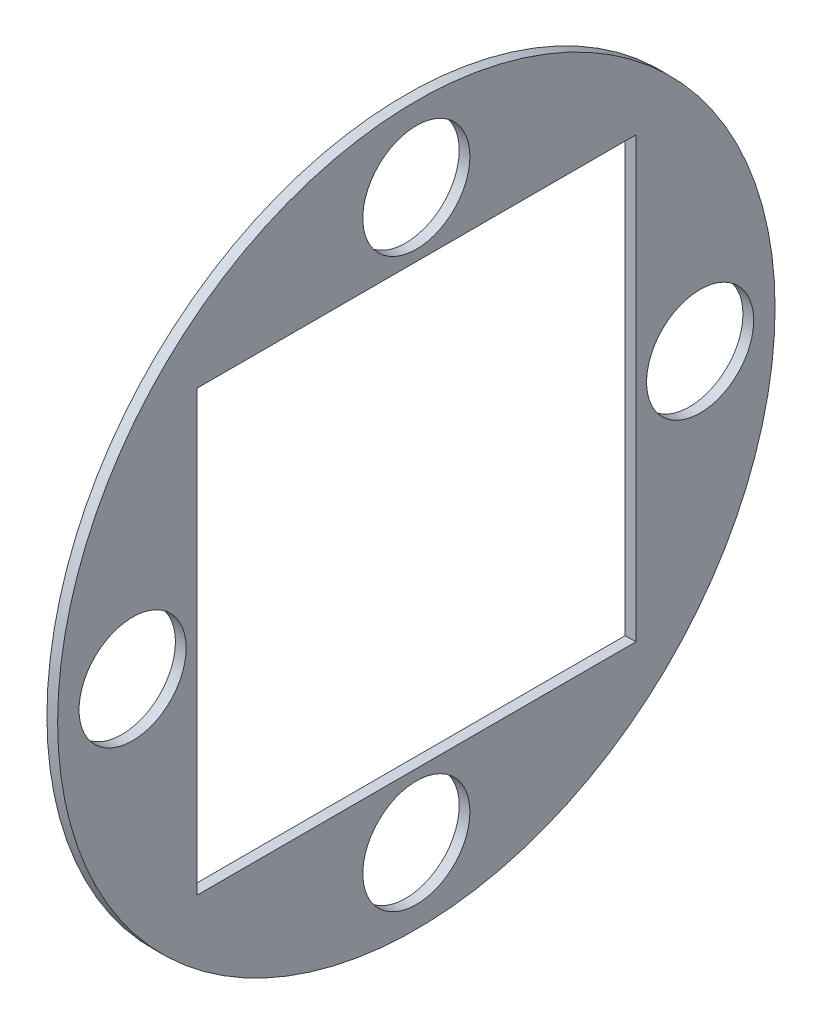
ISO-10303-21;
HEADER;
FILE_DESCRIPTION(('STEP AP214'),'2;1');
FILE_NAME('part.step','',(''),(''),'','','');
FILE_SCHEMA(('AUTOMOTIVE_DESIGN { 1 0 10303 214 1 1 1 1 }'));
ENDSEC;
DATA;
#1=APPLICATION_CONTEXT('core data for automotive mechanical design processes');
#2=APPLICATION_PROTOCOL_DEFINITION('international standard','automotive_design',2000,#1);
#3=PRODUCT_CONTEXT('',#1,'mechanical');
#4=PRODUCT('Part','Part','',(#3));
#5=PRODUCT_RELATED_PRODUCT_CATEGORY('part','',(#4));
#6=PRODUCT_DEFINITION_FORMATION('','',#4);
#7=PRODUCT_DEFINITION_CONTEXT('part definition',#1,'design');
#8=PRODUCT_DEFINITION('design','',#6,#7);
#9=PRODUCT_DEFINITION_SHAPE('','',#8);
#10=(LENGTH_UNIT() NAMED_UNIT(*) SI_UNIT(.MILLI.,.METRE.));
#11=(NAMED_UNIT(*) PLANE_ANGLE_UNIT() SI_UNIT($,.RADIAN.));
#12=(NAMED_UNIT(*) SI_UNIT($,.STERADIAN.) SOLID_ANGLE_UNIT());
#13=UNCERTAINTY_MEASURE_WITH_UNIT(LENGTH_MEASURE(1.E-05),#10,'distance_accuracy_value','');
#14=(GEOMETRIC_REPRESENTATION_CONTEXT(3) GLOBAL_UNCERTAINTY_ASSIGNED_CONTEXT((#13)) GLOBAL_UNIT_ASSIGNED_CONTEXT((#10,
#11,#12)) REPRESENTATION_CONTEXT('',''));
#15=CARTESIAN_POINT('',(0.,0.,0.));
#16=DIRECTION('',(0.,0.,1.));
#17=DIRECTION('',(1.,0.,0.));
#18=AXIS2_PLACEMENT_3D('',#15,#16,#17);
#19=CARTESIAN_POINT('',(2.54,0.,0.));
#20=DIRECTION('',(1.,0.,0.));
#21=DIRECTION('',(0.,0.,-1.));
#22=AXIS2_PLACEMENT_3D('',#19,#20,#21);
#23=PLANE('',#22);
#24=CARTESIAN_POINT('',(2.54,67.31,-2.35011608917531E-13));
#25=DIRECTION('',(1.,0.,0.));
#26=DIRECTION('',(0.,0.,-1.));
#27=AXIS2_PLACEMENT_3D('',#24,#25,#26);
#28=CIRCLE('',#27,12.7);
#29=CARTESIAN_POINT('',(2.54,67.31,-12.7000000000002));
#30=VERTEX_POINT('',#29);
#31=EDGE_CURVE('E273',#30,#30,#28,.T.);
#32=ORIENTED_EDGE('',*,*,#31,.F.);
#33=EDGE_LOOP('',(#32));
#34=FACE_BOUND('',#33,.T.);
#35=CARTESIAN_POINT('',(2.54,-67.31,7.05034826752594E-13));
#36=DIRECTION('',(1.,0.,0.));
#37=DIRECTION('',(0.,0.,-1.));
#38=AXIS2_PLACEMENT_3D('',#35,#36,#37);
#39=CIRCLE('',#38,12.7);
#40=CARTESIAN_POINT('',(2.54,-67.31,-12.6999999999993));
#41=VERTEX_POINT('',#40);
#42=EDGE_CURVE('E158',#41,#41,#39,.T.);
#43=ORIENTED_EDGE('',*,*,#42,.F.);
#44=EDGE_LOOP('',(#43));
#45=FACE_BOUND('',#44,.T.);
#46=CARTESIAN_POINT('',(2.54,0.,0.));
#47=DIRECTION('',(1.,0.,0.));
#48=DIRECTION('',(0.,0.,-1.));
#49=AXIS2_PLACEMENT_3D('',#46,#47,#48);
#50=CIRCLE('',#49,85.09);
#51=CARTESIAN_POINT('',(2.54,0.,-85.09));
#52=VERTEX_POINT('',#51);
#53=EDGE_CURVE('E12',#52,#52,#50,.T.);
#54=ORIENTED_EDGE('',*,*,#53,.T.);
#55=EDGE_LOOP('',(#54));
#56=FACE_BOUND('',#55,.T.);
#57=DIRECTION('',(0.,0.,1.));
#58=VECTOR('',#57,1.);
#59=CARTESIAN_POINT('',(2.54,-52.07,-52.07));
#60=LINE('',#59,#58);
#61=CARTESIAN_POINT('',(2.54,-52.07,-52.07));
#62=VERTEX_POINT('',#61);
#63=CARTESIAN_POINT('',(2.54,-52.07,52.07));
#64=VERTEX_POINT('',#63);
#65=EDGE_CURVE('E135',#62,#64,#60,.T.);
#66=ORIENTED_EDGE('',*,*,#65,.T.);
#67=DIRECTION('',(0.,-1.,0.));
#68=VECTOR('',#67,1.);
#69=CARTESIAN_POINT('',(2.54,52.07,52.07));
#70=LINE('',#69,#68);
#71=CARTESIAN_POINT('',(2.54,52.07,52.07));
#72=VERTEX_POINT('',#71);
#73=EDGE_CURVE('E125',#72,#64,#70,.T.);
#74=ORIENTED_EDGE('',*,*,#73,.F.);
#75=DIRECTION('',(0.,0.,1.));
#76=VECTOR('',#75,1.);
#77=CARTESIAN_POINT('',(2.54,52.07,-52.07));
#78=LINE('',#77,#76);
#79=CARTESIAN_POINT('',(2.54,52.07,-52.07));
#80=VERTEX_POINT('',#79);
#81=EDGE_CURVE('E150',#80,#72,#78,.T.);
#82=ORIENTED_EDGE('',*,*,#81,.F.);
#83=DIRECTION('',(0.,-1.,0.));
#84=VECTOR('',#83,1.);
#85=CARTESIAN_POINT('',(2.54,52.07,-52.07));
#86=LINE('',#85,#84);
#87=EDGE_CURVE('E100',#80,#62,#86,.T.);
#88=ORIENTED_EDGE('',*,*,#87,.T.);
#89=EDGE_LOOP('',(#66,#74,#82,#88));
#90=FACE_BOUND('',#89,.T.);
#91=CARTESIAN_POINT('',(2.54,0.,67.31));
#92=DIRECTION('',(1.,0.,0.));
#93=DIRECTION('',(0.,0.,-1.));
#94=AXIS2_PLACEMENT_3D('',#91,#92,#93);
#95=CIRCLE('',#94,12.7);
#96=CARTESIAN_POINT('',(2.54,0.,54.61));
#97=VERTEX_POINT('',#96);
#98=EDGE_CURVE('E281',#97,#97,#95,.T.);
#99=ORIENTED_EDGE('',*,*,#98,.F.);
#100=EDGE_LOOP('',(#99));
#101=FACE_BOUND('',#100,.T.);
#102=CARTESIAN_POINT('',(2.54,-4.70023217835063E-13,-67.31));
#103=DIRECTION('',(1.,0.,0.));
#104=DIRECTION('',(0.,0.,-1.));
#105=AXIS2_PLACEMENT_3D('',#102,#103,#104);
#106=CIRCLE('',#105,12.7);
#107=CARTESIAN_POINT('',(2.54,-4.70023217835063E-13,-80.01));
#108=VERTEX_POINT('',#107);
#109=EDGE_CURVE('E262',#108,#108,#106,.T.);
#110=ORIENTED_EDGE('',*,*,#109,.F.);
#111=EDGE_LOOP('',(#110));
#112=FACE_BOUND('',#111,.T.);
#113=ADVANCED_FACE('F84',(#34,#45,#56,#90,#101,#112),#23,.T.);
#114=CARTESIAN_POINT('',(0.,0.,0.));
#115=DIRECTION('',(1.,0.,0.));
#116=DIRECTION('',(0.,0.,-1.));
#117=AXIS2_PLACEMENT_3D('',#114,#115,#116);
#118=PLANE('',#117);
#119=CARTESIAN_POINT('',(0.,0.,0.));
#120=DIRECTION('',(1.,0.,0.));
#121=DIRECTION('',(0.,0.,-1.));
#122=AXIS2_PLACEMENT_3D('',#119,#120,#121);
#123=CIRCLE('',#122,85.09);
#124=CARTESIAN_POINT('',(0.,0.,-85.09));
#125=VERTEX_POINT('',#124);
#126=EDGE_CURVE('E88',#125,#125,#123,.T.);
#127=ORIENTED_EDGE('',*,*,#126,.F.);
#128=EDGE_LOOP('',(#127));
#129=FACE_BOUND('',#128,.T.);
#130=DIRECTION('',(0.,-1.,0.));
#131=VECTOR('',#130,1.);
#132=CARTESIAN_POINT('',(0.,52.07,52.07));
#133=LINE('',#132,#131);
#134=CARTESIAN_POINT('',(0.,52.07,52.07));
#135=VERTEX_POINT('',#134);
#136=CARTESIAN_POINT('',(0.,-52.07,52.07));
#137=VERTEX_POINT('',#136);
#138=EDGE_CURVE('E108',#135,#137,#133,.T.);
#139=ORIENTED_EDGE('',*,*,#138,.T.);
#140=DIRECTION('',(0.,0.,1.));
#141=VECTOR('',#140,1.);
#142=CARTESIAN_POINT('',(0.,-52.07,-52.07));
#143=LINE('',#142,#141);
#144=CARTESIAN_POINT('',(0.,-52.07,-52.07));
#145=VERTEX_POINT('',#144);
#146=EDGE_CURVE('E142',#145,#137,#143,.T.);
#147=ORIENTED_EDGE('',*,*,#146,.F.);
#148=DIRECTION('',(0.,-1.,0.));
#149=VECTOR('',#148,1.);
#150=CARTESIAN_POINT('',(0.,52.07,-52.07));
#151=LINE('',#150,#149);
#152=CARTESIAN_POINT('',(0.,52.07,-52.07));
#153=VERTEX_POINT('',#152);
#154=EDGE_CURVE('E161',#153,#145,#151,.T.);
#155=ORIENTED_EDGE('',*,*,#154,.F.);
#156=DIRECTION('',(0.,0.,1.));
#157=VECTOR('',#156,1.);
#158=CARTESIAN_POINT('',(0.,52.07,-52.07));
#159=LINE('',#158,#157);
#160=EDGE_CURVE('E136',#153,#135,#159,.T.);
#161=ORIENTED_EDGE('',*,*,#160,.T.);
#162=EDGE_LOOP('',(#139,#147,#155,#161));
#163=FACE_BOUND('',#162,.T.);
#164=CARTESIAN_POINT('',(0.,-67.31,7.05034826752594E-13));
#165=DIRECTION('',(1.,0.,0.));
#166=DIRECTION('',(0.,0.,-1.));
#167=AXIS2_PLACEMENT_3D('',#164,#165,#166);
#168=CIRCLE('',#167,12.7);
#169=CARTESIAN_POINT('',(0.,-67.31,-12.6999999999993));
#170=VERTEX_POINT('',#169);
#171=EDGE_CURVE('E285',#170,#170,#168,.T.);
#172=ORIENTED_EDGE('',*,*,#171,.T.);
#173=EDGE_LOOP('',(#172));
#174=FACE_BOUND('',#173,.T.);
#175=CARTESIAN_POINT('',(0.,0.,67.31));
#176=DIRECTION('',(1.,0.,0.));
#177=DIRECTION('',(0.,0.,-1.));
#178=AXIS2_PLACEMENT_3D('',#175,#176,#177);
#179=CIRCLE('',#178,12.7);
#180=CARTESIAN_POINT('',(0.,0.,54.61));
#181=VERTEX_POINT('',#180);
#182=EDGE_CURVE('E277',#181,#181,#179,.T.);
#183=ORIENTED_EDGE('',*,*,#182,.T.);
#184=EDGE_LOOP('',(#183));
#185=FACE_BOUND('',#184,.T.);
#186=CARTESIAN_POINT('',(0.,67.31,-2.35011608917531E-13));
#187=DIRECTION('',(1.,0.,0.));
#188=DIRECTION('',(0.,0.,-1.));
#189=AXIS2_PLACEMENT_3D('',#186,#187,#188);
#190=CIRCLE('',#189,12.7);
#191=CARTESIAN_POINT('',(0.,67.31,-12.7000000000002));
#192=VERTEX_POINT('',#191);
#193=EDGE_CURVE('E270',#192,#192,#190,.T.);
#194=ORIENTED_EDGE('',*,*,#193,.T.);
#195=EDGE_LOOP('',(#194));
#196=FACE_BOUND('',#195,.T.);
#197=CARTESIAN_POINT('',(0.,-4.70023217835063E-13,-67.31));
#198=DIRECTION('',(1.,0.,0.));
#199=DIRECTION('',(0.,0.,-1.));
#200=AXIS2_PLACEMENT_3D('',#197,#198,#199);
#201=CIRCLE('',#200,12.7);
#202=CARTESIAN_POINT('',(0.,-4.70023217835063E-13,-80.01));
#203=VERTEX_POINT('',#202);
#204=EDGE_CURVE('E265',#203,#203,#201,.T.);
#205=ORIENTED_EDGE('',*,*,#204,.T.);
#206=EDGE_LOOP('',(#205));
#207=FACE_BOUND('',#206,.T.);
#208=ADVANCED_FACE('F178',(#129,#163,#174,#185,#196,#207),#118,.F.);
#209=CARTESIAN_POINT('',(2.54,0.,0.));
#210=DIRECTION('',(-1.,0.,0.));
#211=DIRECTION('',(0.,0.,1.));
#212=AXIS2_PLACEMENT_3D('',#209,#210,#211);
#213=CYLINDRICAL_SURFACE('',#212,85.09);
#214=ORIENTED_EDGE('',*,*,#53,.F.);
#215=EDGE_LOOP('',(#214));
#216=FACE_BOUND('',#215,.T.);
#217=ORIENTED_EDGE('',*,*,#126,.T.);
#218=EDGE_LOOP('',(#217));
#219=FACE_BOUND('',#218,.T.);
#220=ADVANCED_FACE('F86',(#216,#219),#213,.T.);
#221=CARTESIAN_POINT('',(2.54,52.07,52.07));
#222=DIRECTION('',(0.,0.,-1.));
#223=DIRECTION('',(0.,1.,0.));
#224=AXIS2_PLACEMENT_3D('',#221,#222,#223);
#225=PLANE('',#224);
#226=ORIENTED_EDGE('',*,*,#138,.F.);
#227=DIRECTION('',(-1.,0.,0.));
#228=VECTOR('',#227,1.);
#229=CARTESIAN_POINT('',(2.54,52.07,52.07));
#230=LINE('',#229,#228);
#231=EDGE_CURVE('E130',#72,#135,#230,.T.);
#232=ORIENTED_EDGE('',*,*,#231,.F.);
#233=ORIENTED_EDGE('',*,*,#73,.T.);
#234=DIRECTION('',(-1.,0.,0.));
#235=VECTOR('',#234,1.);
#236=CARTESIAN_POINT('',(2.54,-52.07,52.07));
#237=LINE('',#236,#235);
#238=EDGE_CURVE('E128',#64,#137,#237,.T.);
#239=ORIENTED_EDGE('',*,*,#238,.T.);
#240=EDGE_LOOP('',(#226,#232,#233,#239));
#241=FACE_BOUND('',#240,.T.);
#242=ADVANCED_FACE('F127',(#241),#225,.T.);
#243=CARTESIAN_POINT('',(2.54,-52.07,-52.07));
#244=DIRECTION('',(0.,-1.,0.));
#245=DIRECTION('',(0.,0.,-1.));
#246=AXIS2_PLACEMENT_3D('',#243,#244,#245);
#247=PLANE('',#246);
#248=ORIENTED_EDGE('',*,*,#146,.T.);
#249=ORIENTED_EDGE('',*,*,#238,.F.);
#250=ORIENTED_EDGE('',*,*,#65,.F.);
#251=DIRECTION('',(-1.,0.,0.));
#252=VECTOR('',#251,1.);
#253=CARTESIAN_POINT('',(2.54,-52.07,-52.07));
#254=LINE('',#253,#252);
#255=EDGE_CURVE('E144',#62,#145,#254,.T.);
#256=ORIENTED_EDGE('',*,*,#255,.T.);
#257=EDGE_LOOP('',(#248,#249,#250,#256));
#258=FACE_BOUND('',#257,.T.);
#259=ADVANCED_FACE('F140',(#258),#247,.F.);
#260=CARTESIAN_POINT('',(2.54,52.07,-52.07));
#261=DIRECTION('',(0.,0.,-1.));
#262=DIRECTION('',(0.,1.,0.));
#263=AXIS2_PLACEMENT_3D('',#260,#261,#262);
#264=PLANE('',#263);
#265=ORIENTED_EDGE('',*,*,#154,.T.);
#266=ORIENTED_EDGE('',*,*,#255,.F.);
#267=ORIENTED_EDGE('',*,*,#87,.F.);
#268=DIRECTION('',(-1.,0.,0.));
#269=VECTOR('',#268,1.);
#270=CARTESIAN_POINT('',(2.54,52.07,-52.07));
#271=LINE('',#270,#269);
#272=EDGE_CURVE('E170',#80,#153,#271,.T.);
#273=ORIENTED_EDGE('',*,*,#272,.T.);
#274=EDGE_LOOP('',(#265,#266,#267,#273));
#275=FACE_BOUND('',#274,.T.);
#276=ADVANCED_FACE('F175',(#275),#264,.F.);
#277=CARTESIAN_POINT('',(2.54,52.07,-52.07));
#278=DIRECTION('',(0.,-1.,0.));
#279=DIRECTION('',(0.,0.,-1.));
#280=AXIS2_PLACEMENT_3D('',#277,#278,#279);
#281=PLANE('',#280);
#282=ORIENTED_EDGE('',*,*,#160,.F.);
#283=ORIENTED_EDGE('',*,*,#272,.F.);
#284=ORIENTED_EDGE('',*,*,#81,.T.);
#285=ORIENTED_EDGE('',*,*,#231,.T.);
#286=EDGE_LOOP('',(#282,#283,#284,#285));
#287=FACE_BOUND('',#286,.T.);
#288=ADVANCED_FACE('F181',(#287),#281,.T.);
#289=CARTESIAN_POINT('',(2.54,-67.31,7.05034826752594E-13));
#290=DIRECTION('',(-1.,0.,0.));
#291=DIRECTION('',(0.,0.,1.));
#292=AXIS2_PLACEMENT_3D('',#289,#290,#291);
#293=CYLINDRICAL_SURFACE('',#292,12.7);
#294=ORIENTED_EDGE('',*,*,#42,.T.);
#295=EDGE_LOOP('',(#294));
#296=FACE_BOUND('',#295,.T.);
#297=ORIENTED_EDGE('',*,*,#171,.F.);
#298=EDGE_LOOP('',(#297));
#299=FACE_BOUND('',#298,.T.);
#300=ADVANCED_FACE('F183',(#296,#299),#293,.F.);
#301=CARTESIAN_POINT('',(2.54,0.,67.31));
#302=DIRECTION('',(-1.,0.,0.));
#303=DIRECTION('',(0.,0.,1.));
#304=AXIS2_PLACEMENT_3D('',#301,#302,#303);
#305=CYLINDRICAL_SURFACE('',#304,12.7);
#306=ORIENTED_EDGE('',*,*,#98,.T.);
#307=EDGE_LOOP('',(#306));
#308=FACE_BOUND('',#307,.T.);
#309=ORIENTED_EDGE('',*,*,#182,.F.);
#310=EDGE_LOOP('',(#309));
#311=FACE_BOUND('',#310,.T.);
#312=ADVANCED_FACE('F189',(#308,#311),#305,.F.);
#313=CARTESIAN_POINT('',(2.54,67.31,-2.35011608917531E-13));
#314=DIRECTION('',(-1.,0.,0.));
#315=DIRECTION('',(0.,0.,1.));
#316=AXIS2_PLACEMENT_3D('',#313,#314,#315);
#317=CYLINDRICAL_SURFACE('',#316,12.7);
#318=ORIENTED_EDGE('',*,*,#31,.T.);
#319=EDGE_LOOP('',(#318));
#320=FACE_BOUND('',#319,.T.);
#321=ORIENTED_EDGE('',*,*,#193,.F.);
#322=EDGE_LOOP('',(#321));
#323=FACE_BOUND('',#322,.T.);
#324=ADVANCED_FACE('F236',(#320,#323),#317,.F.);
#325=CARTESIAN_POINT('',(2.54,-4.70023217835063E-13,-67.31));
#326=DIRECTION('',(-1.,0.,0.));
#327=DIRECTION('',(0.,0.,1.));
#328=AXIS2_PLACEMENT_3D('',#325,#326,#327);
#329=CYLINDRICAL_SURFACE('',#328,12.7);
#330=ORIENTED_EDGE('',*,*,#109,.T.);
#331=EDGE_LOOP('',(#330));
#332=FACE_BOUND('',#331,.T.);
#333=ORIENTED_EDGE('',*,*,#204,.F.);
#334=EDGE_LOOP('',(#333));
#335=FACE_BOUND('',#334,.T.);
#336=ADVANCED_FACE('F246',(#332,#335),#329,.F.);
#337=CLOSED_SHELL('',(#113,#208,#220,#242,#259,#276,#288,#300,#312,#324,#336));
#338=MANIFOLD_SOLID_BREP('B2',#337);
#339=ADVANCED_BREP_SHAPE_REPRESENTATION('',(#18,#338),#14);
#340=SHAPE_DEFINITION_REPRESENTATION(#9,#339);
ENDSEC;
END-ISO-10303-21;
